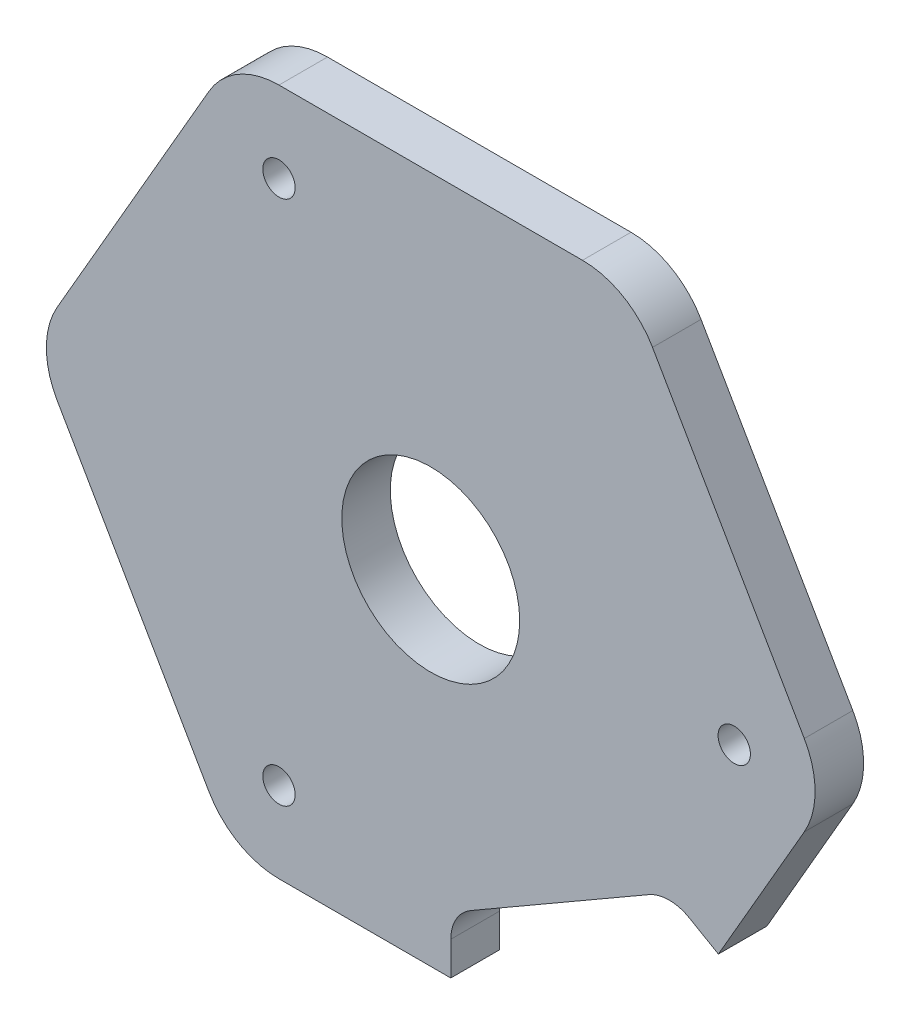
ISO-10303-21;
HEADER;
FILE_DESCRIPTION(('STEP AP214'),'2;1');
FILE_NAME('part.step','',(''),(''),'','','');
FILE_SCHEMA(('AUTOMOTIVE_DESIGN { 1 0 10303 214 1 1 1 1 }'));
ENDSEC;
DATA;
#1=APPLICATION_CONTEXT('core data for automotive mechanical design processes');
#2=APPLICATION_PROTOCOL_DEFINITION('international standard','automotive_design',2000,#1);
#3=PRODUCT_CONTEXT('',#1,'mechanical');
#4=PRODUCT('Part','Part','',(#3));
#5=PRODUCT_RELATED_PRODUCT_CATEGORY('part','',(#4));
#6=PRODUCT_DEFINITION_FORMATION('','',#4);
#7=PRODUCT_DEFINITION_CONTEXT('part definition',#1,'design');
#8=PRODUCT_DEFINITION('design','',#6,#7);
#9=PRODUCT_DEFINITION_SHAPE('','',#8);
#10=(LENGTH_UNIT() NAMED_UNIT(*) SI_UNIT(.MILLI.,.METRE.));
#11=(NAMED_UNIT(*) PLANE_ANGLE_UNIT() SI_UNIT($,.RADIAN.));
#12=(NAMED_UNIT(*) SI_UNIT($,.STERADIAN.) SOLID_ANGLE_UNIT());
#13=UNCERTAINTY_MEASURE_WITH_UNIT(LENGTH_MEASURE(1.E-05),#10,'distance_accuracy_value','');
#14=(GEOMETRIC_REPRESENTATION_CONTEXT(3) GLOBAL_UNCERTAINTY_ASSIGNED_CONTEXT((#13)) GLOBAL_UNIT_ASSIGNED_CONTEXT((#10,
#11,#12)) REPRESENTATION_CONTEXT('',''));
#15=CARTESIAN_POINT('',(0.,0.,0.));
#16=DIRECTION('',(0.,0.,1.));
#17=DIRECTION('',(1.,0.,0.));
#18=AXIS2_PLACEMENT_3D('',#15,#16,#17);
#19=CARTESIAN_POINT('',(-95.2285115238189,152.345498822955,6.));
#20=DIRECTION('',(0.,0.,1.));
#21=DIRECTION('',(1.,0.,0.));
#22=AXIS2_PLACEMENT_3D('',#19,#20,#21);
#23=PLANE('',#22);
#24=CARTESIAN_POINT('',(-76.4646277741299,119.845498823673,6.));
#25=DIRECTION('',(0.,0.,1.));
#26=DIRECTION('',(1.,0.,0.));
#27=AXIS2_PLACEMENT_3D('',#24,#25,#26);
#28=CIRCLE('',#27,10.9999999976088);
#29=CARTESIAN_POINT('',(-65.4646277765211,119.845498823673,6.));
#30=VERTEX_POINT('',#29);
#31=EDGE_CURVE('E400',#30,#30,#28,.T.);
#32=ORIENTED_EDGE('',*,*,#31,.F.);
#33=EDGE_LOOP('',(#32));
#34=FACE_BOUND('',#33,.T.);
#35=CARTESIAN_POINT('',(-38.9368602768175,119.845498824448,6.));
#36=DIRECTION('',(0.,0.,1.));
#37=DIRECTION('',(1.,0.,0.));
#38=AXIS2_PLACEMENT_3D('',#35,#36,#37);
#39=CIRCLE('',#38,1.99999999739521);
#40=CARTESIAN_POINT('',(-36.9368602794223,119.845498824448,6.));
#41=VERTEX_POINT('',#40);
#42=EDGE_CURVE('E198',#41,#41,#39,.T.);
#43=ORIENTED_EDGE('',*,*,#42,.F.);
#44=EDGE_LOOP('',(#43));
#45=FACE_BOUND('',#44,.T.);
#46=CARTESIAN_POINT('',(-95.2285115238189,152.345498822955,6.));
#47=DIRECTION('',(0.,0.,1.));
#48=DIRECTION('',(1.,0.,0.));
#49=AXIS2_PLACEMENT_3D('',#46,#47,#48);
#50=CIRCLE('',#49,10.0000000000001);
#51=CARTESIAN_POINT('',(-95.2285115241266,162.345498822955,6.));
#52=VERTEX_POINT('',#51);
#53=CARTESIAN_POINT('',(-103.888765561738,157.345498822826,6.));
#54=VERTEX_POINT('',#53);
#55=EDGE_CURVE('E240',#52,#54,#50,.T.);
#56=ORIENTED_EDGE('',*,*,#55,.T.);
#57=DIRECTION('',(-0.49999999998711,-0.866025403791881,0.));
#58=VECTOR('',#57,1.);
#59=CARTESIAN_POINT('',(-103.888765561738,157.345498822826,6.));
#60=LINE('',#59,#58);
#61=CARTESIAN_POINT('',(-122.652649309916,124.845498822548,6.));
#62=VERTEX_POINT('',#61);
#63=EDGE_CURVE('E128',#54,#62,#60,.T.);
#64=ORIENTED_EDGE('',*,*,#63,.T.);
#65=CARTESIAN_POINT('',(-113.992395271997,119.845498822677,6.));
#66=DIRECTION('',(0.,0.,1.));
#67=DIRECTION('',(1.,0.,0.));
#68=AXIS2_PLACEMENT_3D('',#65,#66,#67);
#69=CIRCLE('',#68,10.0000000000001);
#70=CARTESIAN_POINT('',(-122.65264930968,114.845498822398,6.));
#71=VERTEX_POINT('',#70);
#72=EDGE_CURVE('E293',#62,#71,#69,.T.);
#73=ORIENTED_EDGE('',*,*,#72,.T.);
#74=DIRECTION('',(0.500000000027894,-0.866025403768334,0.));
#75=VECTOR('',#74,1.);
#76=CARTESIAN_POINT('',(-122.65264930968,114.845498822398,6.));
#77=LINE('',#76,#75);
#78=CARTESIAN_POINT('',(-103.888765559972,82.3454988230041,6.));
#79=VERTEX_POINT('',#78);
#80=EDGE_CURVE('E313',#71,#79,#77,.T.);
#81=ORIENTED_EDGE('',*,*,#80,.T.);
#82=CARTESIAN_POINT('',(-95.2285115222884,87.3454988232831,6.));
#83=DIRECTION('',(0.,0.,1.));
#84=DIRECTION('',(1.,0.,0.));
#85=AXIS2_PLACEMENT_3D('',#82,#83,#84);
#86=CIRCLE('',#85,10.0000000000001);
#87=CARTESIAN_POINT('',(-95.2285115222886,77.345498823283,6.));
#88=VERTEX_POINT('',#87);
#89=EDGE_CURVE('E309',#79,#88,#86,.T.);
#90=ORIENTED_EDGE('',*,*,#89,.T.);
#91=DIRECTION('',(1.,0.,0.));
#92=VECTOR('',#91,1.);
#93=CARTESIAN_POINT('',(-95.2285115222886,77.345498823283,6.));
#94=LINE('',#93,#92);
#95=CARTESIAN_POINT('',(-73.9877217843993,77.3454988232827,6.));
#96=VERTEX_POINT('',#95);
#97=EDGE_CURVE('E312',#88,#96,#94,.T.);
#98=ORIENTED_EDGE('',*,*,#97,.T.);
#99=DIRECTION('',(4.18120274867338E-11,1.,0.));
#100=VECTOR('',#99,1.);
#101=CARTESIAN_POINT('',(-73.9877217843993,77.3454988232827,6.));
#102=LINE('',#101,#100);
#103=CARTESIAN_POINT('',(-73.9877217842266,81.4917059248211,6.));
#104=VERTEX_POINT('',#103);
#105=EDGE_CURVE('E317',#96,#104,#102,.T.);
#106=ORIENTED_EDGE('',*,*,#105,.T.);
#107=CARTESIAN_POINT('',(-68.9877217842282,81.4917059246114,6.));
#108=DIRECTION('',(0.,0.,-1.));
#109=DIRECTION('',(1.,0.,0.));
#110=AXIS2_PLACEMENT_3D('',#107,#108,#109);
#111=CIRCLE('',#110,4.99999999999842);
#112=CARTESIAN_POINT('',(-71.4877217840452,85.8218329436382,6.));
#113=VERTEX_POINT('',#112);
#114=EDGE_CURVE('E324',#104,#113,#111,.T.);
#115=ORIENTED_EDGE('',*,*,#114,.T.);
#116=DIRECTION('',(0.866025403805353,0.499999999963775,0.));
#117=VECTOR('',#116,1.);
#118=CARTESIAN_POINT('',(-71.4877217840452,85.8218329436382,6.));
#119=LINE('',#118,#117);
#120=CARTESIAN_POINT('',(-49.4877217835157,98.5235388648897,6.));
#121=VERTEX_POINT('',#120);
#122=EDGE_CURVE('E327',#113,#121,#119,.T.);
#123=ORIENTED_EDGE('',*,*,#122,.T.);
#124=CARTESIAN_POINT('',(-46.9877217836979,94.1934118458615,6.));
#125=DIRECTION('',(0.,0.,-1.));
#126=DIRECTION('',(1.,0.,0.));
#127=AXIS2_PLACEMENT_3D('',#124,#125,#126);
#128=CIRCLE('',#127,5.00000000000062);
#129=CARTESIAN_POINT('',(-44.4877217835149,98.5235388646798,6.));
#130=VERTEX_POINT('',#129);
#131=EDGE_CURVE('E330',#121,#130,#128,.T.);
#132=ORIENTED_EDGE('',*,*,#131,.T.);
#133=DIRECTION('',(0.866025403763524,-0.500000000036225,0.));
#134=VECTOR('',#133,1.);
#135=CARTESIAN_POINT('',(-44.4877217835149,98.5235388646798,6.));
#136=LINE('',#135,#134);
#137=CARTESIAN_POINT('',(-40.897001107684,96.4504353157038,6.));
#138=VERTEX_POINT('',#137);
#139=EDGE_CURVE('E333',#130,#138,#136,.T.);
#140=ORIENTED_EDGE('',*,*,#139,.T.);
#141=DIRECTION('',(0.500000000018323,0.86602540377386,0.));
#142=VECTOR('',#141,1.);
#143=CARTESIAN_POINT('',(-40.897001107684,96.4504353157038,6.));
#144=LINE('',#143,#142);
#145=CARTESIAN_POINT('',(-30.2766062383502,114.845498824935,6.));
#146=VERTEX_POINT('',#145);
#147=EDGE_CURVE('E336',#138,#146,#144,.T.);
#148=ORIENTED_EDGE('',*,*,#147,.T.);
#149=CARTESIAN_POINT('',(-38.9368602760889,119.845498825118,6.));
#150=DIRECTION('',(0.,0.,1.));
#151=DIRECTION('',(1.,0.,0.));
#152=AXIS2_PLACEMENT_3D('',#149,#150,#151);
#153=CIRCLE('',#152,10.0000000000001);
#154=CARTESIAN_POINT('',(-30.2766062385128,124.845498825583,6.));
#155=VERTEX_POINT('',#154);
#156=EDGE_CURVE('E171',#146,#155,#153,.T.);
#157=ORIENTED_EDGE('',*,*,#156,.T.);
#158=DIRECTION('',(-0.500000000046487,0.866025403757599,0.));
#159=VECTOR('',#158,1.);
#160=CARTESIAN_POINT('',(-30.2766062385128,124.845498825583,6.));
#161=LINE('',#160,#159);
#162=CARTESIAN_POINT('',(-49.0404899889192,157.345498824574,6.));
#163=VERTEX_POINT('',#162);
#164=EDGE_CURVE('E165',#155,#163,#161,.T.);
#165=ORIENTED_EDGE('',*,*,#164,.T.);
#166=CARTESIAN_POINT('',(-57.7007440264953,152.345498824109,6.));
#167=DIRECTION('',(0.,0.,1.));
#168=DIRECTION('',(1.,0.,0.));
#169=AXIS2_PLACEMENT_3D('',#166,#167,#168);
#170=CIRCLE('',#169,10.0000000000001);
#171=CARTESIAN_POINT('',(-57.700744026803,162.345498824109,6.));
#172=VERTEX_POINT('',#171);
#173=EDGE_CURVE('E169',#163,#172,#170,.T.);
#174=ORIENTED_EDGE('',*,*,#173,.T.);
#175=DIRECTION('',(-1.,-3.07703613862716E-11,0.));
#176=VECTOR('',#175,1.);
#177=CARTESIAN_POINT('',(-57.700744026803,162.345498824109,6.));
#178=LINE('',#177,#176);
#179=EDGE_CURVE('E61',#172,#52,#178,.T.);
#180=ORIENTED_EDGE('',*,*,#179,.T.);
#181=EDGE_LOOP('',(#56,#64,#73,#81,#90,#98,#106,#115,#123,#132,#140,#148,#157,#165,#174,#180));
#182=FACE_BOUND('',#181,.T.);
#183=CARTESIAN_POINT('',(-95.2285115221282,87.3454988232769,6.));
#184=DIRECTION('',(0.,0.,1.));
#185=DIRECTION('',(1.,0.,0.));
#186=AXIS2_PLACEMENT_3D('',#183,#184,#185);
#187=CIRCLE('',#186,1.99999999709085);
#188=CARTESIAN_POINT('',(-93.2285115250374,87.3454988232769,6.));
#189=VERTEX_POINT('',#188);
#190=EDGE_CURVE('E408',#189,#189,#187,.T.);
#191=ORIENTED_EDGE('',*,*,#190,.F.);
#192=EDGE_LOOP('',(#191));
#193=FACE_BOUND('',#192,.T.);
#194=CARTESIAN_POINT('',(-95.2285115234816,152.345498823276,6.));
#195=DIRECTION('',(0.,0.,1.));
#196=DIRECTION('',(1.,0.,0.));
#197=AXIS2_PLACEMENT_3D('',#194,#195,#196);
#198=CIRCLE('',#197,1.99999999838505);
#199=CARTESIAN_POINT('',(-93.2285115250966,152.345498823276,6.));
#200=VERTEX_POINT('',#199);
#201=EDGE_CURVE('E389',#200,#200,#198,.T.);
#202=ORIENTED_EDGE('',*,*,#201,.F.);
#203=EDGE_LOOP('',(#202));
#204=FACE_BOUND('',#203,.T.);
#205=ADVANCED_FACE('F43',(#34,#45,#182,#193,#204),#23,.T.);
#206=CARTESIAN_POINT('',(-95.2285115238189,152.345498822955,0.));
#207=DIRECTION('',(0.,0.,1.));
#208=DIRECTION('',(1.,0.,0.));
#209=AXIS2_PLACEMENT_3D('',#206,#207,#208);
#210=PLANE('',#209);
#211=CARTESIAN_POINT('',(-95.2285115238189,152.345498822955,0.));
#212=DIRECTION('',(0.,0.,1.));
#213=DIRECTION('',(1.,0.,0.));
#214=AXIS2_PLACEMENT_3D('',#211,#212,#213);
#215=CIRCLE('',#214,10.0000000000001);
#216=CARTESIAN_POINT('',(-95.2285115241266,162.345498822955,0.));
#217=VERTEX_POINT('',#216);
#218=CARTESIAN_POINT('',(-103.888765561738,157.345498822826,0.));
#219=VERTEX_POINT('',#218);
#220=EDGE_CURVE('E193',#217,#219,#215,.T.);
#221=ORIENTED_EDGE('',*,*,#220,.F.);
#222=DIRECTION('',(-1.,-3.07703613862716E-11,0.));
#223=VECTOR('',#222,1.);
#224=CARTESIAN_POINT('',(-57.700744026803,162.345498824109,0.));
#225=LINE('',#224,#223);
#226=CARTESIAN_POINT('',(-57.700744026803,162.345498824109,0.));
#227=VERTEX_POINT('',#226);
#228=EDGE_CURVE('E120',#227,#217,#225,.T.);
#229=ORIENTED_EDGE('',*,*,#228,.F.);
#230=CARTESIAN_POINT('',(-57.7007440264953,152.345498824109,0.));
#231=DIRECTION('',(0.,0.,1.));
#232=DIRECTION('',(1.,0.,0.));
#233=AXIS2_PLACEMENT_3D('',#230,#231,#232);
#234=CIRCLE('',#233,10.0000000000001);
#235=CARTESIAN_POINT('',(-49.0404899889192,157.345498824574,0.));
#236=VERTEX_POINT('',#235);
#237=EDGE_CURVE('E114',#236,#227,#234,.T.);
#238=ORIENTED_EDGE('',*,*,#237,.F.);
#239=DIRECTION('',(-0.500000000046487,0.866025403757599,0.));
#240=VECTOR('',#239,1.);
#241=CARTESIAN_POINT('',(-30.2766062385128,124.845498825583,0.));
#242=LINE('',#241,#240);
#243=CARTESIAN_POINT('',(-30.2766062385128,124.845498825583,0.));
#244=VERTEX_POINT('',#243);
#245=EDGE_CURVE('E180',#244,#236,#242,.T.);
#246=ORIENTED_EDGE('',*,*,#245,.F.);
#247=CARTESIAN_POINT('',(-38.9368602760889,119.845498825118,0.));
#248=DIRECTION('',(0.,0.,1.));
#249=DIRECTION('',(1.,0.,0.));
#250=AXIS2_PLACEMENT_3D('',#247,#248,#249);
#251=CIRCLE('',#250,10.0000000000001);
#252=CARTESIAN_POINT('',(-30.2766062383502,114.845498824935,0.));
#253=VERTEX_POINT('',#252);
#254=EDGE_CURVE('E231',#253,#244,#251,.T.);
#255=ORIENTED_EDGE('',*,*,#254,.F.);
#256=DIRECTION('',(0.500000000018323,0.86602540377386,0.));
#257=VECTOR('',#256,1.);
#258=CARTESIAN_POINT('',(-40.897001107684,96.4504353157038,0.));
#259=LINE('',#258,#257);
#260=CARTESIAN_POINT('',(-40.897001107684,96.4504353157038,0.));
#261=VERTEX_POINT('',#260);
#262=EDGE_CURVE('E228',#261,#253,#259,.T.);
#263=ORIENTED_EDGE('',*,*,#262,.F.);
#264=DIRECTION('',(0.866025403763524,-0.500000000036225,0.));
#265=VECTOR('',#264,1.);
#266=CARTESIAN_POINT('',(-44.4877217835149,98.5235388646798,0.));
#267=LINE('',#266,#265);
#268=CARTESIAN_POINT('',(-44.4877217835149,98.5235388646798,0.));
#269=VERTEX_POINT('',#268);
#270=EDGE_CURVE('E225',#269,#261,#267,.T.);
#271=ORIENTED_EDGE('',*,*,#270,.F.);
#272=CARTESIAN_POINT('',(-46.9877217836979,94.1934118458615,0.));
#273=DIRECTION('',(0.,0.,-1.));
#274=DIRECTION('',(1.,0.,0.));
#275=AXIS2_PLACEMENT_3D('',#272,#273,#274);
#276=CIRCLE('',#275,5.00000000000062);
#277=CARTESIAN_POINT('',(-49.4877217835157,98.5235388648897,0.));
#278=VERTEX_POINT('',#277);
#279=EDGE_CURVE('E222',#278,#269,#276,.T.);
#280=ORIENTED_EDGE('',*,*,#279,.F.);
#281=DIRECTION('',(0.866025403805353,0.499999999963775,0.));
#282=VECTOR('',#281,1.);
#283=CARTESIAN_POINT('',(-71.4877217840452,85.8218329436382,0.));
#284=LINE('',#283,#282);
#285=CARTESIAN_POINT('',(-71.4877217840452,85.8218329436382,0.));
#286=VERTEX_POINT('',#285);
#287=EDGE_CURVE('E219',#286,#278,#284,.T.);
#288=ORIENTED_EDGE('',*,*,#287,.F.);
#289=CARTESIAN_POINT('',(-68.9877217842282,81.4917059246114,0.));
#290=DIRECTION('',(0.,0.,-1.));
#291=DIRECTION('',(1.,0.,0.));
#292=AXIS2_PLACEMENT_3D('',#289,#290,#291);
#293=CIRCLE('',#292,4.99999999999842);
#294=CARTESIAN_POINT('',(-73.9877217842266,81.4917059248211,0.));
#295=VERTEX_POINT('',#294);
#296=EDGE_CURVE('E216',#295,#286,#293,.T.);
#297=ORIENTED_EDGE('',*,*,#296,.F.);
#298=DIRECTION('',(4.18120274867338E-11,1.,0.));
#299=VECTOR('',#298,1.);
#300=CARTESIAN_POINT('',(-73.9877217843993,77.3454988232827,0.));
#301=LINE('',#300,#299);
#302=CARTESIAN_POINT('',(-73.9877217843993,77.3454988232827,0.));
#303=VERTEX_POINT('',#302);
#304=EDGE_CURVE('E213',#303,#295,#301,.T.);
#305=ORIENTED_EDGE('',*,*,#304,.F.);
#306=DIRECTION('',(1.,0.,0.));
#307=VECTOR('',#306,1.);
#308=CARTESIAN_POINT('',(-95.2285115222886,77.345498823283,0.));
#309=LINE('',#308,#307);
#310=CARTESIAN_POINT('',(-95.2285115222886,77.345498823283,0.));
#311=VERTEX_POINT('',#310);
#312=EDGE_CURVE('E210',#311,#303,#309,.T.);
#313=ORIENTED_EDGE('',*,*,#312,.F.);
#314=CARTESIAN_POINT('',(-95.2285115222884,87.3454988232831,0.));
#315=DIRECTION('',(0.,0.,1.));
#316=DIRECTION('',(1.,0.,0.));
#317=AXIS2_PLACEMENT_3D('',#314,#315,#316);
#318=CIRCLE('',#317,10.0000000000001);
#319=CARTESIAN_POINT('',(-103.888765559972,82.3454988230041,0.));
#320=VERTEX_POINT('',#319);
#321=EDGE_CURVE('E207',#320,#311,#318,.T.);
#322=ORIENTED_EDGE('',*,*,#321,.F.);
#323=DIRECTION('',(0.500000000027894,-0.866025403768334,0.));
#324=VECTOR('',#323,1.);
#325=CARTESIAN_POINT('',(-122.65264930968,114.845498822398,0.));
#326=LINE('',#325,#324);
#327=CARTESIAN_POINT('',(-122.65264930968,114.845498822398,0.));
#328=VERTEX_POINT('',#327);
#329=EDGE_CURVE('E204',#328,#320,#326,.T.);
#330=ORIENTED_EDGE('',*,*,#329,.F.);
#331=CARTESIAN_POINT('',(-113.992395271997,119.845498822677,0.));
#332=DIRECTION('',(0.,0.,1.));
#333=DIRECTION('',(1.,0.,0.));
#334=AXIS2_PLACEMENT_3D('',#331,#332,#333);
#335=CIRCLE('',#334,10.0000000000001);
#336=CARTESIAN_POINT('',(-122.652649309916,124.845498822548,0.));
#337=VERTEX_POINT('',#336);
#338=EDGE_CURVE('E201',#337,#328,#335,.T.);
#339=ORIENTED_EDGE('',*,*,#338,.F.);
#340=DIRECTION('',(-0.49999999998711,-0.866025403791881,0.));
#341=VECTOR('',#340,1.);
#342=CARTESIAN_POINT('',(-103.888765561738,157.345498822826,0.));
#343=LINE('',#342,#341);
#344=EDGE_CURVE('E197',#219,#337,#343,.T.);
#345=ORIENTED_EDGE('',*,*,#344,.F.);
#346=EDGE_LOOP('',(#221,#229,#238,#246,#255,#263,#271,#280,#288,#297,#305,#313,#322,#330,#339,#345));
#347=FACE_BOUND('',#346,.T.);
#348=CARTESIAN_POINT('',(-38.9368602768175,119.845498824448,0.));
#349=DIRECTION('',(0.,0.,1.));
#350=DIRECTION('',(1.,0.,0.));
#351=AXIS2_PLACEMENT_3D('',#348,#349,#350);
#352=CIRCLE('',#351,1.99999999739521);
#353=CARTESIAN_POINT('',(-36.9368602794223,119.845498824448,0.));
#354=VERTEX_POINT('',#353);
#355=EDGE_CURVE('E412',#354,#354,#352,.T.);
#356=ORIENTED_EDGE('',*,*,#355,.T.);
#357=EDGE_LOOP('',(#356));
#358=FACE_BOUND('',#357,.T.);
#359=CARTESIAN_POINT('',(-95.2285115221282,87.3454988232769,0.));
#360=DIRECTION('',(0.,0.,1.));
#361=DIRECTION('',(1.,0.,0.));
#362=AXIS2_PLACEMENT_3D('',#359,#360,#361);
#363=CIRCLE('',#362,1.99999999709085);
#364=CARTESIAN_POINT('',(-93.2285115250374,87.3454988232769,0.));
#365=VERTEX_POINT('',#364);
#366=EDGE_CURVE('E404',#365,#365,#363,.T.);
#367=ORIENTED_EDGE('',*,*,#366,.T.);
#368=EDGE_LOOP('',(#367));
#369=FACE_BOUND('',#368,.T.);
#370=CARTESIAN_POINT('',(-76.4646277741299,119.845498823673,0.));
#371=DIRECTION('',(0.,0.,1.));
#372=DIRECTION('',(1.,0.,0.));
#373=AXIS2_PLACEMENT_3D('',#370,#371,#372);
#374=CIRCLE('',#373,10.9999999976088);
#375=CARTESIAN_POINT('',(-65.4646277765211,119.845498823673,0.));
#376=VERTEX_POINT('',#375);
#377=EDGE_CURVE('E397',#376,#376,#374,.T.);
#378=ORIENTED_EDGE('',*,*,#377,.T.);
#379=EDGE_LOOP('',(#378));
#380=FACE_BOUND('',#379,.T.);
#381=CARTESIAN_POINT('',(-95.2285115234816,152.345498823276,0.));
#382=DIRECTION('',(0.,0.,1.));
#383=DIRECTION('',(1.,0.,0.));
#384=AXIS2_PLACEMENT_3D('',#381,#382,#383);
#385=CIRCLE('',#384,1.99999999838505);
#386=CARTESIAN_POINT('',(-93.2285115250966,152.345498823276,0.));
#387=VERTEX_POINT('',#386);
#388=EDGE_CURVE('E392',#387,#387,#385,.T.);
#389=ORIENTED_EDGE('',*,*,#388,.T.);
#390=EDGE_LOOP('',(#389));
#391=FACE_BOUND('',#390,.T.);
#392=ADVANCED_FACE('F297',(#347,#358,#369,#380,#391),#210,.F.);
#393=CARTESIAN_POINT('',(-95.2285115238189,152.345498822955,6.));
#394=DIRECTION('',(0.,0.,-1.));
#395=DIRECTION('',(-1.,0.,0.));
#396=AXIS2_PLACEMENT_3D('',#393,#394,#395);
#397=CYLINDRICAL_SURFACE('',#396,10.0000000000001);
#398=ORIENTED_EDGE('',*,*,#220,.T.);
#399=DIRECTION('',(0.,0.,-1.));
#400=VECTOR('',#399,1.);
#401=CARTESIAN_POINT('',(-103.888765561738,157.345498822826,6.));
#402=LINE('',#401,#400);
#403=EDGE_CURVE('E11',#54,#219,#402,.T.);
#404=ORIENTED_EDGE('',*,*,#403,.F.);
#405=ORIENTED_EDGE('',*,*,#55,.F.);
#406=DIRECTION('',(0.,0.,-1.));
#407=VECTOR('',#406,1.);
#408=CARTESIAN_POINT('',(-95.2285115241266,162.345498822955,6.));
#409=LINE('',#408,#407);
#410=EDGE_CURVE('E189',#52,#217,#409,.T.);
#411=ORIENTED_EDGE('',*,*,#410,.T.);
#412=EDGE_LOOP('',(#398,#404,#405,#411));
#413=FACE_BOUND('',#412,.T.);
#414=ADVANCED_FACE('F45',(#413),#397,.T.);
#415=CARTESIAN_POINT('',(-103.888765561738,157.345498822826,6.));
#416=DIRECTION('',(0.866025403791881,-0.49999999998711,0.));
#417=DIRECTION('',(0.49999999998711,0.866025403791881,0.));
#418=AXIS2_PLACEMENT_3D('',#415,#416,#417);
#419=PLANE('',#418);
#420=ORIENTED_EDGE('',*,*,#344,.T.);
#421=DIRECTION('',(0.,0.,-1.));
#422=VECTOR('',#421,1.);
#423=CARTESIAN_POINT('',(-122.652649309916,124.845498822548,6.));
#424=LINE('',#423,#422);
#425=EDGE_CURVE('E53',#62,#337,#424,.T.);
#426=ORIENTED_EDGE('',*,*,#425,.F.);
#427=ORIENTED_EDGE('',*,*,#63,.F.);
#428=ORIENTED_EDGE('',*,*,#403,.T.);
#429=EDGE_LOOP('',(#420,#426,#427,#428));
#430=FACE_BOUND('',#429,.T.);
#431=ADVANCED_FACE('F582',(#430),#419,.F.);
#432=CARTESIAN_POINT('',(-113.992395271997,119.845498822677,6.));
#433=DIRECTION('',(0.,0.,-1.));
#434=DIRECTION('',(-1.,0.,0.));
#435=AXIS2_PLACEMENT_3D('',#432,#433,#434);
#436=CYLINDRICAL_SURFACE('',#435,10.0000000000001);
#437=ORIENTED_EDGE('',*,*,#338,.T.);
#438=DIRECTION('',(0.,0.,-1.));
#439=VECTOR('',#438,1.);
#440=CARTESIAN_POINT('',(-122.65264930968,114.845498822398,6.));
#441=LINE('',#440,#439);
#442=EDGE_CURVE('E283',#71,#328,#441,.T.);
#443=ORIENTED_EDGE('',*,*,#442,.F.);
#444=ORIENTED_EDGE('',*,*,#72,.F.);
#445=ORIENTED_EDGE('',*,*,#425,.T.);
#446=EDGE_LOOP('',(#437,#443,#444,#445));
#447=FACE_BOUND('',#446,.T.);
#448=ADVANCED_FACE('F291',(#447),#436,.T.);
#449=CARTESIAN_POINT('',(-122.65264930968,114.845498822398,6.));
#450=DIRECTION('',(0.866025403768334,0.500000000027894,0.));
#451=DIRECTION('',(-0.500000000027894,0.866025403768334,0.));
#452=AXIS2_PLACEMENT_3D('',#449,#450,#451);
#453=PLANE('',#452);
#454=ORIENTED_EDGE('',*,*,#329,.T.);
#455=DIRECTION('',(0.,0.,-1.));
#456=VECTOR('',#455,1.);
#457=CARTESIAN_POINT('',(-103.888765559972,82.3454988230041,6.));
#458=LINE('',#457,#456);
#459=EDGE_CURVE('E279',#79,#320,#458,.T.);
#460=ORIENTED_EDGE('',*,*,#459,.F.);
#461=ORIENTED_EDGE('',*,*,#80,.F.);
#462=ORIENTED_EDGE('',*,*,#442,.T.);
#463=EDGE_LOOP('',(#454,#460,#461,#462));
#464=FACE_BOUND('',#463,.T.);
#465=ADVANCED_FACE('F303',(#464),#453,.F.);
#466=CARTESIAN_POINT('',(-95.2285115222884,87.3454988232831,6.));
#467=DIRECTION('',(0.,0.,-1.));
#468=DIRECTION('',(-1.,0.,0.));
#469=AXIS2_PLACEMENT_3D('',#466,#467,#468);
#470=CYLINDRICAL_SURFACE('',#469,10.0000000000001);
#471=ORIENTED_EDGE('',*,*,#321,.T.);
#472=DIRECTION('',(0.,0.,-1.));
#473=VECTOR('',#472,1.);
#474=CARTESIAN_POINT('',(-95.2285115222886,77.345498823283,6.));
#475=LINE('',#474,#473);
#476=EDGE_CURVE('E275',#88,#311,#475,.T.);
#477=ORIENTED_EDGE('',*,*,#476,.F.);
#478=ORIENTED_EDGE('',*,*,#89,.F.);
#479=ORIENTED_EDGE('',*,*,#459,.T.);
#480=EDGE_LOOP('',(#471,#477,#478,#479));
#481=FACE_BOUND('',#480,.T.);
#482=ADVANCED_FACE('F307',(#481),#470,.T.);
#483=CARTESIAN_POINT('',(-95.2285115222886,77.345498823283,6.));
#484=DIRECTION('',(0.,1.,0.));
#485=DIRECTION('',(-1.,0.,0.));
#486=AXIS2_PLACEMENT_3D('',#483,#484,#485);
#487=PLANE('',#486);
#488=ORIENTED_EDGE('',*,*,#312,.T.);
#489=DIRECTION('',(0.,0.,-1.));
#490=VECTOR('',#489,1.);
#491=CARTESIAN_POINT('',(-73.9877217843993,77.3454988232827,6.));
#492=LINE('',#491,#490);
#493=EDGE_CURVE('E271',#96,#303,#492,.T.);
#494=ORIENTED_EDGE('',*,*,#493,.F.);
#495=ORIENTED_EDGE('',*,*,#97,.F.);
#496=ORIENTED_EDGE('',*,*,#476,.T.);
#497=EDGE_LOOP('',(#488,#494,#495,#496));
#498=FACE_BOUND('',#497,.T.);
#499=ADVANCED_FACE('F543',(#498),#487,.F.);
#500=CARTESIAN_POINT('',(-73.9877217843993,77.3454988232827,6.));
#501=DIRECTION('',(-1.,4.18120274867338E-11,0.));
#502=DIRECTION('',(-4.18120274867338E-11,-1.,0.));
#503=AXIS2_PLACEMENT_3D('',#500,#501,#502);
#504=PLANE('',#503);
#505=ORIENTED_EDGE('',*,*,#304,.T.);
#506=DIRECTION('',(0.,0.,-1.));
#507=VECTOR('',#506,1.);
#508=CARTESIAN_POINT('',(-73.9877217842266,81.4917059248211,6.));
#509=LINE('',#508,#507);
#510=EDGE_CURVE('E267',#104,#295,#509,.T.);
#511=ORIENTED_EDGE('',*,*,#510,.F.);
#512=ORIENTED_EDGE('',*,*,#105,.F.);
#513=ORIENTED_EDGE('',*,*,#493,.T.);
#514=EDGE_LOOP('',(#505,#511,#512,#513));
#515=FACE_BOUND('',#514,.T.);
#516=ADVANCED_FACE('F532',(#515),#504,.F.);
#517=CARTESIAN_POINT('',(-68.9877217842282,81.4917059246114,6.));
#518=DIRECTION('',(0.,0.,-1.));
#519=DIRECTION('',(-1.,0.,0.));
#520=AXIS2_PLACEMENT_3D('',#517,#518,#519);
#521=CYLINDRICAL_SURFACE('',#520,4.99999999999842);
#522=ORIENTED_EDGE('',*,*,#296,.T.);
#523=DIRECTION('',(0.,0.,-1.));
#524=VECTOR('',#523,1.);
#525=CARTESIAN_POINT('',(-71.4877217840452,85.8218329436382,6.));
#526=LINE('',#525,#524);
#527=EDGE_CURVE('E263',#113,#286,#526,.T.);
#528=ORIENTED_EDGE('',*,*,#527,.F.);
#529=ORIENTED_EDGE('',*,*,#114,.F.);
#530=ORIENTED_EDGE('',*,*,#510,.T.);
#531=EDGE_LOOP('',(#522,#528,#529,#530));
#532=FACE_BOUND('',#531,.T.);
#533=ADVANCED_FACE('F521',(#532),#521,.F.);
#534=CARTESIAN_POINT('',(-71.4877217840452,85.8218329436382,6.));
#535=DIRECTION('',(-0.499999999963775,0.866025403805353,0.));
#536=DIRECTION('',(-0.866025403805353,-0.499999999963775,0.));
#537=AXIS2_PLACEMENT_3D('',#534,#535,#536);
#538=PLANE('',#537);
#539=ORIENTED_EDGE('',*,*,#287,.T.);
#540=DIRECTION('',(0.,0.,-1.));
#541=VECTOR('',#540,1.);
#542=CARTESIAN_POINT('',(-49.4877217835157,98.5235388648897,6.));
#543=LINE('',#542,#541);
#544=EDGE_CURVE('E259',#121,#278,#543,.T.);
#545=ORIENTED_EDGE('',*,*,#544,.F.);
#546=ORIENTED_EDGE('',*,*,#122,.F.);
#547=ORIENTED_EDGE('',*,*,#527,.T.);
#548=EDGE_LOOP('',(#539,#545,#546,#547));
#549=FACE_BOUND('',#548,.T.);
#550=ADVANCED_FACE('F510',(#549),#538,.F.);
#551=CARTESIAN_POINT('',(-46.9877217836979,94.1934118458615,6.));
#552=DIRECTION('',(0.,0.,-1.));
#553=DIRECTION('',(-1.,0.,0.));
#554=AXIS2_PLACEMENT_3D('',#551,#552,#553);
#555=CYLINDRICAL_SURFACE('',#554,5.00000000000062);
#556=ORIENTED_EDGE('',*,*,#279,.T.);
#557=DIRECTION('',(0.,0.,-1.));
#558=VECTOR('',#557,1.);
#559=CARTESIAN_POINT('',(-44.4877217835149,98.5235388646798,6.));
#560=LINE('',#559,#558);
#561=EDGE_CURVE('E255',#130,#269,#560,.T.);
#562=ORIENTED_EDGE('',*,*,#561,.F.);
#563=ORIENTED_EDGE('',*,*,#131,.F.);
#564=ORIENTED_EDGE('',*,*,#544,.T.);
#565=EDGE_LOOP('',(#556,#562,#563,#564));
#566=FACE_BOUND('',#565,.T.);
#567=ADVANCED_FACE('F499',(#566),#555,.F.);
#568=CARTESIAN_POINT('',(-44.4877217835149,98.5235388646798,6.));
#569=DIRECTION('',(0.500000000036224,0.866025403763524,0.));
#570=DIRECTION('',(-0.866025403763525,0.500000000036225,0.));
#571=AXIS2_PLACEMENT_3D('',#568,#569,#570);
#572=PLANE('',#571);
#573=ORIENTED_EDGE('',*,*,#270,.T.);
#574=DIRECTION('',(0.,0.,-1.));
#575=VECTOR('',#574,1.);
#576=CARTESIAN_POINT('',(-40.897001107684,96.4504353157038,6.));
#577=LINE('',#576,#575);
#578=EDGE_CURVE('E251',#138,#261,#577,.T.);
#579=ORIENTED_EDGE('',*,*,#578,.F.);
#580=ORIENTED_EDGE('',*,*,#139,.F.);
#581=ORIENTED_EDGE('',*,*,#561,.T.);
#582=EDGE_LOOP('',(#573,#579,#580,#581));
#583=FACE_BOUND('',#582,.T.);
#584=ADVANCED_FACE('F489',(#583),#572,.F.);
#585=CARTESIAN_POINT('',(-40.897001107684,96.4504353157038,6.));
#586=DIRECTION('',(-0.86602540377386,0.500000000018323,0.));
#587=DIRECTION('',(-0.500000000018323,-0.86602540377386,0.));
#588=AXIS2_PLACEMENT_3D('',#585,#586,#587);
#589=PLANE('',#588);
#590=ORIENTED_EDGE('',*,*,#262,.T.);
#591=DIRECTION('',(0.,0.,-1.));
#592=VECTOR('',#591,1.);
#593=CARTESIAN_POINT('',(-30.2766062383502,114.845498824935,6.));
#594=LINE('',#593,#592);
#595=EDGE_CURVE('E247',#146,#253,#594,.T.);
#596=ORIENTED_EDGE('',*,*,#595,.F.);
#597=ORIENTED_EDGE('',*,*,#147,.F.);
#598=ORIENTED_EDGE('',*,*,#578,.T.);
#599=EDGE_LOOP('',(#590,#596,#597,#598));
#600=FACE_BOUND('',#599,.T.);
#601=ADVANCED_FACE('F344',(#600),#589,.F.);
#602=CARTESIAN_POINT('',(-38.9368602760889,119.845498825118,6.));
#603=DIRECTION('',(0.,0.,-1.));
#604=DIRECTION('',(-1.,0.,0.));
#605=AXIS2_PLACEMENT_3D('',#602,#603,#604);
#606=CYLINDRICAL_SURFACE('',#605,10.0000000000001);
#607=ORIENTED_EDGE('',*,*,#254,.T.);
#608=DIRECTION('',(0.,0.,-1.));
#609=VECTOR('',#608,1.);
#610=CARTESIAN_POINT('',(-30.2766062385128,124.845498825583,6.));
#611=LINE('',#610,#609);
#612=EDGE_CURVE('E182',#155,#244,#611,.T.);
#613=ORIENTED_EDGE('',*,*,#612,.F.);
#614=ORIENTED_EDGE('',*,*,#156,.F.);
#615=ORIENTED_EDGE('',*,*,#595,.T.);
#616=EDGE_LOOP('',(#607,#613,#614,#615));
#617=FACE_BOUND('',#616,.T.);
#618=ADVANCED_FACE('F348',(#617),#606,.T.);
#619=CARTESIAN_POINT('',(-30.2766062385128,124.845498825583,6.));
#620=DIRECTION('',(-0.866025403757599,-0.500000000046487,0.));
#621=DIRECTION('',(0.500000000046487,-0.866025403757599,0.));
#622=AXIS2_PLACEMENT_3D('',#619,#620,#621);
#623=PLANE('',#622);
#624=ORIENTED_EDGE('',*,*,#245,.T.);
#625=DIRECTION('',(0.,0.,-1.));
#626=VECTOR('',#625,1.);
#627=CARTESIAN_POINT('',(-49.0404899889192,157.345498824574,6.));
#628=LINE('',#627,#626);
#629=EDGE_CURVE('E177',#163,#236,#628,.T.);
#630=ORIENTED_EDGE('',*,*,#629,.F.);
#631=ORIENTED_EDGE('',*,*,#164,.F.);
#632=ORIENTED_EDGE('',*,*,#612,.T.);
#633=EDGE_LOOP('',(#624,#630,#631,#632));
#634=FACE_BOUND('',#633,.T.);
#635=ADVANCED_FACE('F178',(#634),#623,.F.);
#636=CARTESIAN_POINT('',(-57.7007440264953,152.345498824109,6.));
#637=DIRECTION('',(0.,0.,-1.));
#638=DIRECTION('',(-1.,0.,0.));
#639=AXIS2_PLACEMENT_3D('',#636,#637,#638);
#640=CYLINDRICAL_SURFACE('',#639,10.0000000000001);
#641=ORIENTED_EDGE('',*,*,#237,.T.);
#642=DIRECTION('',(0.,0.,-1.));
#643=VECTOR('',#642,1.);
#644=CARTESIAN_POINT('',(-57.700744026803,162.345498824109,6.));
#645=LINE('',#644,#643);
#646=EDGE_CURVE('E183',#172,#227,#645,.T.);
#647=ORIENTED_EDGE('',*,*,#646,.F.);
#648=ORIENTED_EDGE('',*,*,#173,.F.);
#649=ORIENTED_EDGE('',*,*,#629,.T.);
#650=EDGE_LOOP('',(#641,#647,#648,#649));
#651=FACE_BOUND('',#650,.T.);
#652=ADVANCED_FACE('F185',(#651),#640,.T.);
#653=CARTESIAN_POINT('',(-57.700744026803,162.345498824109,6.));
#654=DIRECTION('',(3.07703613862716E-11,-1.,0.));
#655=DIRECTION('',(1.,3.07703613862716E-11,0.));
#656=AXIS2_PLACEMENT_3D('',#653,#654,#655);
#657=PLANE('',#656);
#658=ORIENTED_EDGE('',*,*,#228,.T.);
#659=ORIENTED_EDGE('',*,*,#410,.F.);
#660=ORIENTED_EDGE('',*,*,#179,.F.);
#661=ORIENTED_EDGE('',*,*,#646,.T.);
#662=EDGE_LOOP('',(#658,#659,#660,#661));
#663=FACE_BOUND('',#662,.T.);
#664=ADVANCED_FACE('F352',(#663),#657,.F.);
#665=CARTESIAN_POINT('',(-38.9368602768175,119.845498824448,6.));
#666=DIRECTION('',(0.,0.,-1.));
#667=DIRECTION('',(-1.,0.,0.));
#668=AXIS2_PLACEMENT_3D('',#665,#666,#667);
#669=CYLINDRICAL_SURFACE('',#668,1.99999999739521);
#670=ORIENTED_EDGE('',*,*,#42,.T.);
#671=EDGE_LOOP('',(#670));
#672=FACE_BOUND('',#671,.T.);
#673=ORIENTED_EDGE('',*,*,#355,.F.);
#674=EDGE_LOOP('',(#673));
#675=FACE_BOUND('',#674,.T.);
#676=ADVANCED_FACE('F354',(#672,#675),#669,.F.);
#677=CARTESIAN_POINT('',(-95.2285115221282,87.3454988232769,6.));
#678=DIRECTION('',(0.,0.,-1.));
#679=DIRECTION('',(-1.,0.,0.));
#680=AXIS2_PLACEMENT_3D('',#677,#678,#679);
#681=CYLINDRICAL_SURFACE('',#680,1.99999999709085);
#682=ORIENTED_EDGE('',*,*,#190,.T.);
#683=EDGE_LOOP('',(#682));
#684=FACE_BOUND('',#683,.T.);
#685=ORIENTED_EDGE('',*,*,#366,.F.);
#686=EDGE_LOOP('',(#685));
#687=FACE_BOUND('',#686,.T.);
#688=ADVANCED_FACE('F360',(#684,#687),#681,.F.);
#689=CARTESIAN_POINT('',(-76.4646277741299,119.845498823673,6.));
#690=DIRECTION('',(0.,0.,-1.));
#691=DIRECTION('',(-1.,0.,0.));
#692=AXIS2_PLACEMENT_3D('',#689,#690,#691);
#693=CYLINDRICAL_SURFACE('',#692,10.9999999976088);
#694=ORIENTED_EDGE('',*,*,#31,.T.);
#695=EDGE_LOOP('',(#694));
#696=FACE_BOUND('',#695,.T.);
#697=ORIENTED_EDGE('',*,*,#377,.F.);
#698=EDGE_LOOP('',(#697));
#699=FACE_BOUND('',#698,.T.);
#700=ADVANCED_FACE('F376',(#696,#699),#693,.F.);
#701=CARTESIAN_POINT('',(-95.2285115234816,152.345498823276,6.));
#702=DIRECTION('',(0.,0.,-1.));
#703=DIRECTION('',(-1.,0.,0.));
#704=AXIS2_PLACEMENT_3D('',#701,#702,#703);
#705=CYLINDRICAL_SURFACE('',#704,1.99999999838505);
#706=ORIENTED_EDGE('',*,*,#201,.T.);
#707=EDGE_LOOP('',(#706));
#708=FACE_BOUND('',#707,.T.);
#709=ORIENTED_EDGE('',*,*,#388,.F.);
#710=EDGE_LOOP('',(#709));
#711=FACE_BOUND('',#710,.T.);
#712=ADVANCED_FACE('F380',(#708,#711),#705,.F.);
#713=CLOSED_SHELL('',(#205,#392,#414,#431,#448,#465,#482,#499,#516,#533,#550,#567,#584,#601,
#618,#635,#652,#664,#676,#688,#700,#712));
#714=MANIFOLD_SOLID_BREP('B2',#713);
#715=ADVANCED_BREP_SHAPE_REPRESENTATION('',(#18,#714),#14);
#716=SHAPE_DEFINITION_REPRESENTATION(#9,#715);
ENDSEC;
END-ISO-10303-21;
